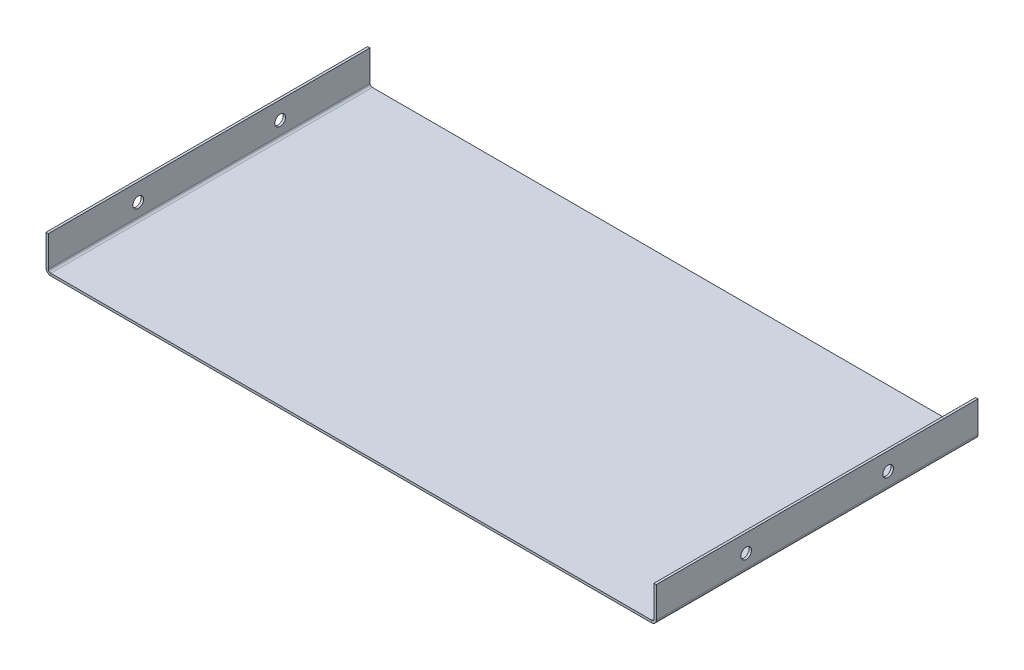
ISO-10303-21;
HEADER;
FILE_DESCRIPTION(('STEP AP214'),'2;1');
FILE_NAME('part.step','',(''),(''),'','','');
FILE_SCHEMA(('AUTOMOTIVE_DESIGN { 1 0 10303 214 1 1 1 1 }'));
ENDSEC;
DATA;
#1=APPLICATION_CONTEXT('core data for automotive mechanical design processes');
#2=APPLICATION_PROTOCOL_DEFINITION('international standard','automotive_design',2000,#1);
#3=PRODUCT_CONTEXT('',#1,'mechanical');
#4=PRODUCT('Part','Part','',(#3));
#5=PRODUCT_RELATED_PRODUCT_CATEGORY('part','',(#4));
#6=PRODUCT_DEFINITION_FORMATION('','',#4);
#7=PRODUCT_DEFINITION_CONTEXT('part definition',#1,'design');
#8=PRODUCT_DEFINITION('design','',#6,#7);
#9=PRODUCT_DEFINITION_SHAPE('','',#8);
#10=(LENGTH_UNIT() NAMED_UNIT(*) SI_UNIT(.MILLI.,.METRE.));
#11=(NAMED_UNIT(*) PLANE_ANGLE_UNIT() SI_UNIT($,.RADIAN.));
#12=(NAMED_UNIT(*) SI_UNIT($,.STERADIAN.) SOLID_ANGLE_UNIT());
#13=UNCERTAINTY_MEASURE_WITH_UNIT(LENGTH_MEASURE(1.E-05),#10,'distance_accuracy_value','');
#14=(GEOMETRIC_REPRESENTATION_CONTEXT(3) GLOBAL_UNCERTAINTY_ASSIGNED_CONTEXT((#13)) GLOBAL_UNIT_ASSIGNED_CONTEXT((#10,
#11,#12)) REPRESENTATION_CONTEXT('',''));
#15=CARTESIAN_POINT('',(0.,0.,0.));
#16=DIRECTION('',(0.,0.,1.));
#17=DIRECTION('',(1.,0.,0.));
#18=AXIS2_PLACEMENT_3D('',#15,#16,#17);
#19=CARTESIAN_POINT('',(0.,-1.,0.));
#20=DIRECTION('',(0.,-1.,0.));
#21=DIRECTION('',(0.,0.,-1.));
#22=AXIS2_PLACEMENT_3D('',#19,#20,#21);
#23=PLANE('',#22);
#24=DIRECTION('',(-1.,0.,0.));
#25=VECTOR('',#24,1.);
#26=CARTESIAN_POINT('',(0.,-1.,-136.));
#27=LINE('',#26,#25);
#28=CARTESIAN_POINT('',(255.,-0.999999999999996,-136.));
#29=VERTEX_POINT('',#28);
#30=CARTESIAN_POINT('',(0.999999999999997,-1.,-136.));
#31=VERTEX_POINT('',#30);
#32=EDGE_CURVE('E11',#29,#31,#27,.T.);
#33=ORIENTED_EDGE('',*,*,#32,.F.);
#34=DIRECTION('',(0.,0.,-1.));
#35=VECTOR('',#34,1.);
#36=CARTESIAN_POINT('',(255.,-0.999999999999996,-136.));
#37=LINE('',#36,#35);
#38=CARTESIAN_POINT('',(255.,-1.,0.));
#39=VERTEX_POINT('',#38);
#40=EDGE_CURVE('E217',#29,#39,#37,.F.);
#41=ORIENTED_EDGE('',*,*,#40,.T.);
#42=DIRECTION('',(1.,0.,0.));
#43=VECTOR('',#42,1.);
#44=CARTESIAN_POINT('',(0.,-1.,0.));
#45=LINE('',#44,#43);
#46=CARTESIAN_POINT('',(0.999999999999997,-1.,0.));
#47=VERTEX_POINT('',#46);
#48=EDGE_CURVE('E48',#47,#39,#45,.T.);
#49=ORIENTED_EDGE('',*,*,#48,.F.);
#50=DIRECTION('',(0.,0.,1.));
#51=VECTOR('',#50,1.);
#52=CARTESIAN_POINT('',(0.999999999999997,-1.,0.));
#53=LINE('',#52,#51);
#54=EDGE_CURVE('E62',#47,#31,#53,.F.);
#55=ORIENTED_EDGE('',*,*,#54,.T.);
#56=EDGE_LOOP('',(#33,#41,#49,#55));
#57=FACE_BOUND('',#56,.T.);
#58=ADVANCED_FACE('F39',(#57),#23,.T.);
#59=CARTESIAN_POINT('',(0.,0.,0.));
#60=DIRECTION('',(0.,-1.,0.));
#61=DIRECTION('',(0.,0.,-1.));
#62=AXIS2_PLACEMENT_3D('',#59,#60,#61);
#63=PLANE('',#62);
#64=DIRECTION('',(0.,0.,-1.));
#65=VECTOR('',#64,1.);
#66=CARTESIAN_POINT('',(255.,0.,-136.));
#67=LINE('',#66,#65);
#68=CARTESIAN_POINT('',(255.,0.,-136.));
#69=VERTEX_POINT('',#68);
#70=CARTESIAN_POINT('',(255.,0.,0.));
#71=VERTEX_POINT('',#70);
#72=EDGE_CURVE('E230',#69,#71,#67,.F.);
#73=ORIENTED_EDGE('',*,*,#72,.F.);
#74=DIRECTION('',(-1.,0.,0.));
#75=VECTOR('',#74,1.);
#76=CARTESIAN_POINT('',(0.,0.,-136.));
#77=LINE('',#76,#75);
#78=CARTESIAN_POINT('',(0.999999999999997,0.,-136.));
#79=VERTEX_POINT('',#78);
#80=EDGE_CURVE('E151',#69,#79,#77,.T.);
#81=ORIENTED_EDGE('',*,*,#80,.T.);
#82=DIRECTION('',(0.,0.,1.));
#83=VECTOR('',#82,1.);
#84=CARTESIAN_POINT('',(0.999999999999997,0.,0.));
#85=LINE('',#84,#83);
#86=CARTESIAN_POINT('',(0.999999999999997,0.,0.));
#87=VERTEX_POINT('',#86);
#88=EDGE_CURVE('E106',#87,#79,#85,.F.);
#89=ORIENTED_EDGE('',*,*,#88,.F.);
#90=DIRECTION('',(1.,0.,0.));
#91=VECTOR('',#90,1.);
#92=CARTESIAN_POINT('',(0.,0.,0.));
#93=LINE('',#92,#91);
#94=EDGE_CURVE('E148',#87,#71,#93,.T.);
#95=ORIENTED_EDGE('',*,*,#94,.T.);
#96=EDGE_LOOP('',(#73,#81,#89,#95));
#97=FACE_BOUND('',#96,.T.);
#98=ADVANCED_FACE('F339',(#97),#63,.F.);
#99=CARTESIAN_POINT('',(0.,-1.,-136.));
#100=DIRECTION('',(0.,0.,-1.));
#101=DIRECTION('',(-1.,0.,0.));
#102=AXIS2_PLACEMENT_3D('',#99,#100,#101);
#103=PLANE('',#102);
#104=ORIENTED_EDGE('',*,*,#80,.F.);
#105=DIRECTION('',(0.,-1.,0.));
#106=VECTOR('',#105,1.);
#107=CARTESIAN_POINT('',(255.,0.,-136.));
#108=LINE('',#107,#106);
#109=EDGE_CURVE('E224',#69,#29,#108,.T.);
#110=ORIENTED_EDGE('',*,*,#109,.T.);
#111=ORIENTED_EDGE('',*,*,#32,.T.);
#112=DIRECTION('',(0.,-1.,0.));
#113=VECTOR('',#112,1.);
#114=CARTESIAN_POINT('',(0.999999999999997,0.,-136.));
#115=LINE('',#114,#113);
#116=EDGE_CURVE('E145',#79,#31,#115,.T.);
#117=ORIENTED_EDGE('',*,*,#116,.F.);
#118=EDGE_LOOP('',(#104,#110,#111,#117));
#119=FACE_BOUND('',#118,.T.);
#120=ADVANCED_FACE('F345',(#119),#103,.T.);
#121=CARTESIAN_POINT('',(0.,-1.,0.));
#122=DIRECTION('',(0.,0.,1.));
#123=DIRECTION('',(1.,0.,0.));
#124=AXIS2_PLACEMENT_3D('',#121,#122,#123);
#125=PLANE('',#124);
#126=DIRECTION('',(0.,-1.,0.));
#127=VECTOR('',#126,1.);
#128=CARTESIAN_POINT('',(255.,0.,0.));
#129=LINE('',#128,#127);
#130=EDGE_CURVE('E235',#71,#39,#129,.T.);
#131=ORIENTED_EDGE('',*,*,#130,.F.);
#132=ORIENTED_EDGE('',*,*,#94,.F.);
#133=DIRECTION('',(0.,-1.,0.));
#134=VECTOR('',#133,1.);
#135=CARTESIAN_POINT('',(0.999999999999997,0.,0.));
#136=LINE('',#135,#134);
#137=EDGE_CURVE('E105',#87,#47,#136,.T.);
#138=ORIENTED_EDGE('',*,*,#137,.T.);
#139=ORIENTED_EDGE('',*,*,#48,.T.);
#140=EDGE_LOOP('',(#131,#132,#138,#139));
#141=FACE_BOUND('',#140,.T.);
#142=ADVANCED_FACE('F41',(#141),#125,.T.);
#143=CARTESIAN_POINT('',(0.999999999999997,1.,-136.));
#144=DIRECTION('',(0.,0.,-1.));
#145=DIRECTION('',(-1.,0.,0.));
#146=AXIS2_PLACEMENT_3D('',#143,#144,#145);
#147=PLANE('',#146);
#148=DIRECTION('',(-1.,0.,0.));
#149=VECTOR('',#148,1.);
#150=CARTESIAN_POINT('',(0.,0.999999999999997,-136.));
#151=LINE('',#150,#149);
#152=CARTESIAN_POINT('',(0.,0.999999999999997,-136.));
#153=VERTEX_POINT('',#152);
#154=CARTESIAN_POINT('',(-1.,0.999999999999993,-136.));
#155=VERTEX_POINT('',#154);
#156=EDGE_CURVE('E96',#153,#155,#151,.T.);
#157=ORIENTED_EDGE('',*,*,#156,.F.);
#158=CARTESIAN_POINT('',(0.999999999999997,1.,-136.));
#159=DIRECTION('',(0.,0.,1.));
#160=DIRECTION('',(1.,0.,0.));
#161=AXIS2_PLACEMENT_3D('',#158,#159,#160);
#162=CIRCLE('',#161,1.);
#163=EDGE_CURVE('E90',#79,#153,#162,.F.);
#164=ORIENTED_EDGE('',*,*,#163,.F.);
#165=ORIENTED_EDGE('',*,*,#116,.T.);
#166=CARTESIAN_POINT('',(0.999999999999997,1.,-136.));
#167=DIRECTION('',(0.,0.,1.));
#168=DIRECTION('',(1.,0.,0.));
#169=AXIS2_PLACEMENT_3D('',#166,#167,#168);
#170=CIRCLE('',#169,2.);
#171=EDGE_CURVE('E138',#31,#155,#170,.F.);
#172=ORIENTED_EDGE('',*,*,#171,.T.);
#173=EDGE_LOOP('',(#157,#164,#165,#172));
#174=FACE_BOUND('',#173,.T.);
#175=ADVANCED_FACE('F258',(#174),#147,.T.);
#176=CARTESIAN_POINT('',(0.999999999999997,1.,0.));
#177=DIRECTION('',(0.,0.,-1.));
#178=DIRECTION('',(-1.,0.,0.));
#179=AXIS2_PLACEMENT_3D('',#176,#177,#178);
#180=PLANE('',#179);
#181=CARTESIAN_POINT('',(0.999999999999997,1.,0.));
#182=DIRECTION('',(0.,0.,1.));
#183=DIRECTION('',(1.,0.,0.));
#184=AXIS2_PLACEMENT_3D('',#181,#182,#183);
#185=CIRCLE('',#184,1.);
#186=CARTESIAN_POINT('',(0.,0.999999999999997,0.));
#187=VERTEX_POINT('',#186);
#188=EDGE_CURVE('E87',#187,#87,#185,.T.);
#189=ORIENTED_EDGE('',*,*,#188,.F.);
#190=DIRECTION('',(-1.,0.,0.));
#191=VECTOR('',#190,1.);
#192=CARTESIAN_POINT('',(0.,0.999999999999997,0.));
#193=LINE('',#192,#191);
#194=CARTESIAN_POINT('',(-1.,0.999999999999993,0.));
#195=VERTEX_POINT('',#194);
#196=EDGE_CURVE('E95',#187,#195,#193,.T.);
#197=ORIENTED_EDGE('',*,*,#196,.T.);
#198=CARTESIAN_POINT('',(0.999999999999997,1.,0.));
#199=DIRECTION('',(0.,0.,1.));
#200=DIRECTION('',(1.,0.,0.));
#201=AXIS2_PLACEMENT_3D('',#198,#199,#200);
#202=CIRCLE('',#201,2.);
#203=EDGE_CURVE('E139',#195,#47,#202,.T.);
#204=ORIENTED_EDGE('',*,*,#203,.T.);
#205=ORIENTED_EDGE('',*,*,#137,.F.);
#206=EDGE_LOOP('',(#189,#197,#204,#205));
#207=FACE_BOUND('',#206,.T.);
#208=ADVANCED_FACE('F101',(#207),#180,.F.);
#209=CARTESIAN_POINT('',(0.999999999999997,1.,0.));
#210=DIRECTION('',(0.,0.,1.));
#211=DIRECTION('',(-1.,0.,0.));
#212=AXIS2_PLACEMENT_3D('',#209,#210,#211);
#213=CYLINDRICAL_SURFACE('',#212,2.);
#214=ORIENTED_EDGE('',*,*,#54,.F.);
#215=ORIENTED_EDGE('',*,*,#203,.F.);
#216=DIRECTION('',(0.,0.,-1.));
#217=VECTOR('',#216,1.);
#218=CARTESIAN_POINT('',(-1.,0.999999999999993,0.));
#219=LINE('',#218,#217);
#220=EDGE_CURVE('E119',#195,#155,#219,.T.);
#221=ORIENTED_EDGE('',*,*,#220,.T.);
#222=ORIENTED_EDGE('',*,*,#171,.F.);
#223=EDGE_LOOP('',(#214,#215,#221,#222));
#224=FACE_BOUND('',#223,.T.);
#225=ADVANCED_FACE('F259',(#224),#213,.T.);
#226=CARTESIAN_POINT('',(0.999999999999997,1.,0.));
#227=DIRECTION('',(0.,0.,1.));
#228=DIRECTION('',(-1.,0.,0.));
#229=AXIS2_PLACEMENT_3D('',#226,#227,#228);
#230=CYLINDRICAL_SURFACE('',#229,1.);
#231=ORIENTED_EDGE('',*,*,#88,.T.);
#232=ORIENTED_EDGE('',*,*,#163,.T.);
#233=DIRECTION('',(0.,0.,1.));
#234=VECTOR('',#233,1.);
#235=CARTESIAN_POINT('',(0.,0.999999999999997,-136.));
#236=LINE('',#235,#234);
#237=EDGE_CURVE('E83',#153,#187,#236,.T.);
#238=ORIENTED_EDGE('',*,*,#237,.T.);
#239=ORIENTED_EDGE('',*,*,#188,.T.);
#240=EDGE_LOOP('',(#231,#232,#238,#239));
#241=FACE_BOUND('',#240,.T.);
#242=ADVANCED_FACE('F86',(#241),#230,.F.);
#243=CARTESIAN_POINT('',(-1.,0.,-136.));
#244=DIRECTION('',(0.,0.,1.));
#245=DIRECTION('',(1.,0.,0.));
#246=AXIS2_PLACEMENT_3D('',#243,#244,#245);
#247=PLANE('',#246);
#248=ORIENTED_EDGE('',*,*,#156,.T.);
#249=DIRECTION('',(0.,-1.,0.));
#250=VECTOR('',#249,1.);
#251=CARTESIAN_POINT('',(-1.,0.,-136.));
#252=LINE('',#251,#250);
#253=CARTESIAN_POINT('',(-1.00000000000005,14.,-136.));
#254=VERTEX_POINT('',#253);
#255=EDGE_CURVE('E127',#254,#155,#252,.T.);
#256=ORIENTED_EDGE('',*,*,#255,.F.);
#257=DIRECTION('',(1.,0.,0.));
#258=VECTOR('',#257,1.);
#259=CARTESIAN_POINT('',(-1.00000000000005,14.,-136.));
#260=LINE('',#259,#258);
#261=CARTESIAN_POINT('',(0.,14.,-136.));
#262=VERTEX_POINT('',#261);
#263=EDGE_CURVE('E132',#254,#262,#260,.T.);
#264=ORIENTED_EDGE('',*,*,#263,.T.);
#265=DIRECTION('',(0.,-1.,0.));
#266=VECTOR('',#265,1.);
#267=CARTESIAN_POINT('',(0.,0.,-136.));
#268=LINE('',#267,#266);
#269=EDGE_CURVE('E125',#262,#153,#268,.T.);
#270=ORIENTED_EDGE('',*,*,#269,.T.);
#271=EDGE_LOOP('',(#248,#256,#264,#270));
#272=FACE_BOUND('',#271,.T.);
#273=ADVANCED_FACE('F256',(#272),#247,.F.);
#274=CARTESIAN_POINT('',(-1.00000000000005,14.,0.));
#275=DIRECTION('',(0.,0.,-1.));
#276=DIRECTION('',(-1.,0.,0.));
#277=AXIS2_PLACEMENT_3D('',#274,#275,#276);
#278=PLANE('',#277);
#279=ORIENTED_EDGE('',*,*,#196,.F.);
#280=DIRECTION('',(0.,1.,0.));
#281=VECTOR('',#280,1.);
#282=CARTESIAN_POINT('',(0.,14.,0.));
#283=LINE('',#282,#281);
#284=CARTESIAN_POINT('',(0.,14.,0.));
#285=VERTEX_POINT('',#284);
#286=EDGE_CURVE('E115',#187,#285,#283,.T.);
#287=ORIENTED_EDGE('',*,*,#286,.T.);
#288=DIRECTION('',(1.,0.,0.));
#289=VECTOR('',#288,1.);
#290=CARTESIAN_POINT('',(-1.00000000000005,14.,0.));
#291=LINE('',#290,#289);
#292=CARTESIAN_POINT('',(-1.00000000000005,14.,0.));
#293=VERTEX_POINT('',#292);
#294=EDGE_CURVE('E107',#293,#285,#291,.T.);
#295=ORIENTED_EDGE('',*,*,#294,.F.);
#296=DIRECTION('',(0.,1.,0.));
#297=VECTOR('',#296,1.);
#298=CARTESIAN_POINT('',(-1.00000000000005,14.,0.));
#299=LINE('',#298,#297);
#300=EDGE_CURVE('E118',#195,#293,#299,.T.);
#301=ORIENTED_EDGE('',*,*,#300,.F.);
#302=EDGE_LOOP('',(#279,#287,#295,#301));
#303=FACE_BOUND('',#302,.T.);
#304=ADVANCED_FACE('F112',(#303),#278,.F.);
#305=CARTESIAN_POINT('',(-1.,0.,0.));
#306=DIRECTION('',(1.,0.,0.));
#307=DIRECTION('',(0.,1.,0.));
#308=AXIS2_PLACEMENT_3D('',#305,#306,#307);
#309=PLANE('',#308);
#310=CARTESIAN_POINT('',(-1.,6.50000000000056,-98.0000000000018));
#311=DIRECTION('',(1.,0.,0.));
#312=DIRECTION('',(0.,1.,0.));
#313=AXIS2_PLACEMENT_3D('',#310,#311,#312);
#314=CIRCLE('',#313,2.24999999999995);
#315=CARTESIAN_POINT('',(-1.00000000000001,8.75000000000052,-98.0000000000018));
#316=VERTEX_POINT('',#315);
#317=EDGE_CURVE('E177',#316,#316,#314,.T.);
#318=ORIENTED_EDGE('',*,*,#317,.T.);
#319=EDGE_LOOP('',(#318));
#320=FACE_BOUND('',#319,.T.);
#321=CARTESIAN_POINT('',(-1.,6.50000000000056,-38.0000000000018));
#322=DIRECTION('',(1.,0.,0.));
#323=DIRECTION('',(0.,1.,0.));
#324=AXIS2_PLACEMENT_3D('',#321,#322,#323);
#325=CIRCLE('',#324,2.24999999999996);
#326=CARTESIAN_POINT('',(-1.00000000000001,8.75000000000052,-38.0000000000018));
#327=VERTEX_POINT('',#326);
#328=EDGE_CURVE('E166',#327,#327,#325,.T.);
#329=ORIENTED_EDGE('',*,*,#328,.T.);
#330=EDGE_LOOP('',(#329));
#331=FACE_BOUND('',#330,.T.);
#332=ORIENTED_EDGE('',*,*,#220,.F.);
#333=ORIENTED_EDGE('',*,*,#300,.T.);
#334=DIRECTION('',(0.,0.,-1.));
#335=VECTOR('',#334,1.);
#336=CARTESIAN_POINT('',(-1.00000000000005,14.,-136.));
#337=LINE('',#336,#335);
#338=EDGE_CURVE('E135',#293,#254,#337,.T.);
#339=ORIENTED_EDGE('',*,*,#338,.T.);
#340=ORIENTED_EDGE('',*,*,#255,.T.);
#341=EDGE_LOOP('',(#332,#333,#339,#340));
#342=FACE_BOUND('',#341,.T.);
#343=ADVANCED_FACE('F248',(#320,#331,#342),#309,.F.);
#344=CARTESIAN_POINT('',(0.,0.,0.));
#345=DIRECTION('',(1.,0.,0.));
#346=DIRECTION('',(0.,1.,0.));
#347=AXIS2_PLACEMENT_3D('',#344,#345,#346);
#348=PLANE('',#347);
#349=CARTESIAN_POINT('',(0.,6.50000000000056,-98.0000000000018));
#350=DIRECTION('',(1.,0.,0.));
#351=DIRECTION('',(0.,1.,0.));
#352=AXIS2_PLACEMENT_3D('',#349,#350,#351);
#353=CIRCLE('',#352,2.24999999999995);
#354=CARTESIAN_POINT('',(0.,8.75000000000052,-98.0000000000018));
#355=VERTEX_POINT('',#354);
#356=EDGE_CURVE('E174',#355,#355,#353,.T.);
#357=ORIENTED_EDGE('',*,*,#356,.F.);
#358=EDGE_LOOP('',(#357));
#359=FACE_BOUND('',#358,.T.);
#360=CARTESIAN_POINT('',(0.,6.50000000000056,-38.0000000000018));
#361=DIRECTION('',(1.,0.,0.));
#362=DIRECTION('',(0.,1.,0.));
#363=AXIS2_PLACEMENT_3D('',#360,#361,#362);
#364=CIRCLE('',#363,2.24999999999996);
#365=CARTESIAN_POINT('',(0.,8.75000000000052,-38.0000000000018));
#366=VERTEX_POINT('',#365);
#367=EDGE_CURVE('E161',#366,#366,#364,.T.);
#368=ORIENTED_EDGE('',*,*,#367,.F.);
#369=EDGE_LOOP('',(#368));
#370=FACE_BOUND('',#369,.T.);
#371=ORIENTED_EDGE('',*,*,#286,.F.);
#372=ORIENTED_EDGE('',*,*,#237,.F.);
#373=ORIENTED_EDGE('',*,*,#269,.F.);
#374=DIRECTION('',(0.,0.,-1.));
#375=VECTOR('',#374,1.);
#376=CARTESIAN_POINT('',(0.,14.,-136.));
#377=LINE('',#376,#375);
#378=EDGE_CURVE('E124',#285,#262,#377,.T.);
#379=ORIENTED_EDGE('',*,*,#378,.F.);
#380=EDGE_LOOP('',(#371,#372,#373,#379));
#381=FACE_BOUND('',#380,.T.);
#382=ADVANCED_FACE('F122',(#359,#370,#381),#348,.T.);
#383=CARTESIAN_POINT('',(-1.00000000000005,14.,-136.));
#384=DIRECTION('',(0.,-1.,0.));
#385=DIRECTION('',(1.,0.,0.));
#386=AXIS2_PLACEMENT_3D('',#383,#384,#385);
#387=PLANE('',#386);
#388=ORIENTED_EDGE('',*,*,#378,.T.);
#389=ORIENTED_EDGE('',*,*,#263,.F.);
#390=ORIENTED_EDGE('',*,*,#338,.F.);
#391=ORIENTED_EDGE('',*,*,#294,.T.);
#392=EDGE_LOOP('',(#388,#389,#390,#391));
#393=FACE_BOUND('',#392,.T.);
#394=ADVANCED_FACE('F253',(#393),#387,.F.);
#395=CARTESIAN_POINT('',(255.,1.,0.));
#396=DIRECTION('',(0.,0.,1.));
#397=DIRECTION('',(1.,0.,0.));
#398=AXIS2_PLACEMENT_3D('',#395,#396,#397);
#399=PLANE('',#398);
#400=DIRECTION('',(1.,0.,0.));
#401=VECTOR('',#400,1.);
#402=CARTESIAN_POINT('',(256.,1.,0.));
#403=LINE('',#402,#401);
#404=CARTESIAN_POINT('',(256.,1.,0.));
#405=VERTEX_POINT('',#404);
#406=CARTESIAN_POINT('',(257.,0.999999999999997,0.));
#407=VERTEX_POINT('',#406);
#408=EDGE_CURVE('E180',#405,#407,#403,.T.);
#409=ORIENTED_EDGE('',*,*,#408,.F.);
#410=CARTESIAN_POINT('',(255.,1.,0.));
#411=DIRECTION('',(0.,0.,-1.));
#412=DIRECTION('',(-1.,0.,0.));
#413=AXIS2_PLACEMENT_3D('',#410,#411,#412);
#414=CIRCLE('',#413,1.);
#415=EDGE_CURVE('E227',#71,#405,#414,.F.);
#416=ORIENTED_EDGE('',*,*,#415,.F.);
#417=ORIENTED_EDGE('',*,*,#130,.T.);
#418=CARTESIAN_POINT('',(255.,1.,0.));
#419=DIRECTION('',(0.,0.,-1.));
#420=DIRECTION('',(-1.,0.,0.));
#421=AXIS2_PLACEMENT_3D('',#418,#419,#420);
#422=CIRCLE('',#421,2.);
#423=EDGE_CURVE('E220',#39,#407,#422,.F.);
#424=ORIENTED_EDGE('',*,*,#423,.T.);
#425=EDGE_LOOP('',(#409,#416,#417,#424));
#426=FACE_BOUND('',#425,.T.);
#427=ADVANCED_FACE('F317',(#426),#399,.T.);
#428=CARTESIAN_POINT('',(255.,1.,-136.));
#429=DIRECTION('',(0.,0.,1.));
#430=DIRECTION('',(1.,0.,0.));
#431=AXIS2_PLACEMENT_3D('',#428,#429,#430);
#432=PLANE('',#431);
#433=CARTESIAN_POINT('',(255.,1.,-136.));
#434=DIRECTION('',(0.,0.,-1.));
#435=DIRECTION('',(-1.,0.,0.));
#436=AXIS2_PLACEMENT_3D('',#433,#434,#435);
#437=CIRCLE('',#436,1.);
#438=CARTESIAN_POINT('',(256.,1.,-136.));
#439=VERTEX_POINT('',#438);
#440=EDGE_CURVE('E216',#439,#69,#437,.T.);
#441=ORIENTED_EDGE('',*,*,#440,.F.);
#442=DIRECTION('',(1.,0.,0.));
#443=VECTOR('',#442,1.);
#444=CARTESIAN_POINT('',(256.,1.,-136.));
#445=LINE('',#444,#443);
#446=CARTESIAN_POINT('',(257.,0.999999999999997,-136.));
#447=VERTEX_POINT('',#446);
#448=EDGE_CURVE('E184',#439,#447,#445,.T.);
#449=ORIENTED_EDGE('',*,*,#448,.T.);
#450=CARTESIAN_POINT('',(255.,1.,-136.));
#451=DIRECTION('',(0.,0.,-1.));
#452=DIRECTION('',(-1.,0.,0.));
#453=AXIS2_PLACEMENT_3D('',#450,#451,#452);
#454=CIRCLE('',#453,2.);
#455=EDGE_CURVE('E221',#447,#29,#454,.T.);
#456=ORIENTED_EDGE('',*,*,#455,.T.);
#457=ORIENTED_EDGE('',*,*,#109,.F.);
#458=EDGE_LOOP('',(#441,#449,#456,#457));
#459=FACE_BOUND('',#458,.T.);
#460=ADVANCED_FACE('F298',(#459),#432,.F.);
#461=CARTESIAN_POINT('',(255.,1.,-136.));
#462=DIRECTION('',(0.,0.,-1.));
#463=DIRECTION('',(1.,0.,0.));
#464=AXIS2_PLACEMENT_3D('',#461,#462,#463);
#465=CYLINDRICAL_SURFACE('',#464,2.);
#466=ORIENTED_EDGE('',*,*,#40,.F.);
#467=ORIENTED_EDGE('',*,*,#455,.F.);
#468=DIRECTION('',(0.,0.,1.));
#469=VECTOR('',#468,1.);
#470=CARTESIAN_POINT('',(257.,0.999999999999997,0.));
#471=LINE('',#470,#469);
#472=EDGE_CURVE('E187',#447,#407,#471,.T.);
#473=ORIENTED_EDGE('',*,*,#472,.T.);
#474=ORIENTED_EDGE('',*,*,#423,.F.);
#475=EDGE_LOOP('',(#466,#467,#473,#474));
#476=FACE_BOUND('',#475,.T.);
#477=ADVANCED_FACE('F293',(#476),#465,.T.);
#478=CARTESIAN_POINT('',(255.,1.,-136.));
#479=DIRECTION('',(0.,0.,-1.));
#480=DIRECTION('',(1.,0.,0.));
#481=AXIS2_PLACEMENT_3D('',#478,#479,#480);
#482=CYLINDRICAL_SURFACE('',#481,1.);
#483=ORIENTED_EDGE('',*,*,#72,.T.);
#484=ORIENTED_EDGE('',*,*,#415,.T.);
#485=DIRECTION('',(0.,0.,-1.));
#486=VECTOR('',#485,1.);
#487=CARTESIAN_POINT('',(256.,1.,0.));
#488=LINE('',#487,#486);
#489=EDGE_CURVE('E181',#405,#439,#488,.T.);
#490=ORIENTED_EDGE('',*,*,#489,.T.);
#491=ORIENTED_EDGE('',*,*,#440,.T.);
#492=EDGE_LOOP('',(#483,#484,#490,#491));
#493=FACE_BOUND('',#492,.T.);
#494=ADVANCED_FACE('F321',(#493),#482,.F.);
#495=CARTESIAN_POINT('',(257.,0.,0.));
#496=DIRECTION('',(0.,0.,-1.));
#497=DIRECTION('',(-1.,0.,0.));
#498=AXIS2_PLACEMENT_3D('',#495,#496,#497);
#499=PLANE('',#498);
#500=ORIENTED_EDGE('',*,*,#408,.T.);
#501=DIRECTION('',(0.,-1.,0.));
#502=VECTOR('',#501,1.);
#503=CARTESIAN_POINT('',(257.,0.,0.));
#504=LINE('',#503,#502);
#505=CARTESIAN_POINT('',(257.,14.,0.));
#506=VERTEX_POINT('',#505);
#507=EDGE_CURVE('E193',#506,#407,#504,.T.);
#508=ORIENTED_EDGE('',*,*,#507,.F.);
#509=DIRECTION('',(-1.,0.,0.));
#510=VECTOR('',#509,1.);
#511=CARTESIAN_POINT('',(257.,14.,0.));
#512=LINE('',#511,#510);
#513=CARTESIAN_POINT('',(256.,14.,0.));
#514=VERTEX_POINT('',#513);
#515=EDGE_CURVE('E203',#506,#514,#512,.T.);
#516=ORIENTED_EDGE('',*,*,#515,.T.);
#517=DIRECTION('',(0.,-1.,0.));
#518=VECTOR('',#517,1.);
#519=CARTESIAN_POINT('',(256.,0.,0.));
#520=LINE('',#519,#518);
#521=EDGE_CURVE('E192',#514,#405,#520,.T.);
#522=ORIENTED_EDGE('',*,*,#521,.T.);
#523=EDGE_LOOP('',(#500,#508,#516,#522));
#524=FACE_BOUND('',#523,.T.);
#525=ADVANCED_FACE('F314',(#524),#499,.F.);
#526=CARTESIAN_POINT('',(257.,14.,-136.));
#527=DIRECTION('',(0.,0.,1.));
#528=DIRECTION('',(1.,0.,0.));
#529=AXIS2_PLACEMENT_3D('',#526,#527,#528);
#530=PLANE('',#529);
#531=ORIENTED_EDGE('',*,*,#448,.F.);
#532=DIRECTION('',(0.,1.,0.));
#533=VECTOR('',#532,1.);
#534=CARTESIAN_POINT('',(256.,14.,-136.));
#535=LINE('',#534,#533);
#536=CARTESIAN_POINT('',(256.,14.,-136.));
#537=VERTEX_POINT('',#536);
#538=EDGE_CURVE('E206',#439,#537,#535,.T.);
#539=ORIENTED_EDGE('',*,*,#538,.T.);
#540=DIRECTION('',(-1.,0.,0.));
#541=VECTOR('',#540,1.);
#542=CARTESIAN_POINT('',(257.,14.,-136.));
#543=LINE('',#542,#541);
#544=CARTESIAN_POINT('',(257.,14.,-136.));
#545=VERTEX_POINT('',#544);
#546=EDGE_CURVE('E213',#545,#537,#543,.T.);
#547=ORIENTED_EDGE('',*,*,#546,.F.);
#548=DIRECTION('',(0.,1.,0.));
#549=VECTOR('',#548,1.);
#550=CARTESIAN_POINT('',(257.,14.,-136.));
#551=LINE('',#550,#549);
#552=EDGE_CURVE('E196',#447,#545,#551,.T.);
#553=ORIENTED_EDGE('',*,*,#552,.F.);
#554=EDGE_LOOP('',(#531,#539,#547,#553));
#555=FACE_BOUND('',#554,.T.);
#556=ADVANCED_FACE('F306',(#555),#530,.F.);
#557=CARTESIAN_POINT('',(257.,-1.0185525324247E-12,0.));
#558=DIRECTION('',(-1.,0.,0.));
#559=DIRECTION('',(0.,-1.,0.));
#560=AXIS2_PLACEMENT_3D('',#557,#558,#559);
#561=PLANE('',#560);
#562=CARTESIAN_POINT('',(257.,6.50000000000105,-98.0000000000006));
#563=DIRECTION('',(-1.,0.,0.));
#564=DIRECTION('',(0.,-1.,0.));
#565=AXIS2_PLACEMENT_3D('',#562,#563,#564);
#566=CIRCLE('',#565,2.24999999999995);
#567=CARTESIAN_POINT('',(257.,4.2500000000011,-98.0000000000006));
#568=VERTEX_POINT('',#567);
#569=EDGE_CURVE('E171',#568,#568,#566,.T.);
#570=ORIENTED_EDGE('',*,*,#569,.T.);
#571=EDGE_LOOP('',(#570));
#572=FACE_BOUND('',#571,.T.);
#573=CARTESIAN_POINT('',(257.,6.50000000000105,-38.0000000000006));
#574=DIRECTION('',(-1.,0.,0.));
#575=DIRECTION('',(0.,-1.,0.));
#576=AXIS2_PLACEMENT_3D('',#573,#574,#575);
#577=CIRCLE('',#576,2.24999999999996);
#578=CARTESIAN_POINT('',(257.,4.25000000000109,-38.0000000000006));
#579=VERTEX_POINT('',#578);
#580=EDGE_CURVE('E157',#579,#579,#577,.T.);
#581=ORIENTED_EDGE('',*,*,#580,.T.);
#582=EDGE_LOOP('',(#581));
#583=FACE_BOUND('',#582,.T.);
#584=ORIENTED_EDGE('',*,*,#472,.F.);
#585=ORIENTED_EDGE('',*,*,#552,.T.);
#586=DIRECTION('',(0.,0.,1.));
#587=VECTOR('',#586,1.);
#588=CARTESIAN_POINT('',(257.,14.,0.));
#589=LINE('',#588,#587);
#590=EDGE_CURVE('E200',#545,#506,#589,.T.);
#591=ORIENTED_EDGE('',*,*,#590,.T.);
#592=ORIENTED_EDGE('',*,*,#507,.T.);
#593=EDGE_LOOP('',(#584,#585,#591,#592));
#594=FACE_BOUND('',#593,.T.);
#595=ADVANCED_FACE('F303',(#572,#583,#594),#561,.F.);
#596=CARTESIAN_POINT('',(256.,-1.01506105108586E-12,0.));
#597=DIRECTION('',(-1.,0.,0.));
#598=DIRECTION('',(0.,-1.,0.));
#599=AXIS2_PLACEMENT_3D('',#596,#597,#598);
#600=PLANE('',#599);
#601=CARTESIAN_POINT('',(256.,6.50000000000105,-98.0000000000006));
#602=DIRECTION('',(-1.,0.,0.));
#603=DIRECTION('',(0.,-1.,0.));
#604=AXIS2_PLACEMENT_3D('',#601,#602,#603);
#605=CIRCLE('',#604,2.24999999999995);
#606=CARTESIAN_POINT('',(256.,4.25000000000109,-98.0000000000006));
#607=VERTEX_POINT('',#606);
#608=EDGE_CURVE('E43',#607,#607,#605,.T.);
#609=ORIENTED_EDGE('',*,*,#608,.F.);
#610=EDGE_LOOP('',(#609));
#611=FACE_BOUND('',#610,.T.);
#612=CARTESIAN_POINT('',(256.,6.50000000000105,-38.0000000000006));
#613=DIRECTION('',(-1.,0.,0.));
#614=DIRECTION('',(0.,-1.,0.));
#615=AXIS2_PLACEMENT_3D('',#612,#613,#614);
#616=CIRCLE('',#615,2.24999999999996);
#617=CARTESIAN_POINT('',(256.,4.25000000000109,-38.0000000000006));
#618=VERTEX_POINT('',#617);
#619=EDGE_CURVE('E155',#618,#618,#616,.T.);
#620=ORIENTED_EDGE('',*,*,#619,.F.);
#621=EDGE_LOOP('',(#620));
#622=FACE_BOUND('',#621,.T.);
#623=ORIENTED_EDGE('',*,*,#538,.F.);
#624=ORIENTED_EDGE('',*,*,#489,.F.);
#625=ORIENTED_EDGE('',*,*,#521,.F.);
#626=DIRECTION('',(0.,0.,1.));
#627=VECTOR('',#626,1.);
#628=CARTESIAN_POINT('',(256.,14.,0.));
#629=LINE('',#628,#627);
#630=EDGE_CURVE('E197',#537,#514,#629,.T.);
#631=ORIENTED_EDGE('',*,*,#630,.F.);
#632=EDGE_LOOP('',(#623,#624,#625,#631));
#633=FACE_BOUND('',#632,.T.);
#634=ADVANCED_FACE('F324',(#611,#622,#633),#600,.T.);
#635=CARTESIAN_POINT('',(257.,14.,0.));
#636=DIRECTION('',(0.,-1.,0.));
#637=DIRECTION('',(1.,0.,0.));
#638=AXIS2_PLACEMENT_3D('',#635,#636,#637);
#639=PLANE('',#638);
#640=ORIENTED_EDGE('',*,*,#630,.T.);
#641=ORIENTED_EDGE('',*,*,#515,.F.);
#642=ORIENTED_EDGE('',*,*,#590,.F.);
#643=ORIENTED_EDGE('',*,*,#546,.T.);
#644=EDGE_LOOP('',(#640,#641,#642,#643));
#645=FACE_BOUND('',#644,.T.);
#646=ADVANCED_FACE('F311',(#645),#639,.F.);
#647=CARTESIAN_POINT('',(276.000000000002,6.50000000000108,-38.0000000000006));
#648=DIRECTION('',(-1.,0.,0.));
#649=DIRECTION('',(0.,0.,1.));
#650=AXIS2_PLACEMENT_3D('',#647,#648,#649);
#651=CYLINDRICAL_SURFACE('',#650,2.24999999999996);
#652=ORIENTED_EDGE('',*,*,#619,.T.);
#653=EDGE_LOOP('',(#652));
#654=FACE_BOUND('',#653,.T.);
#655=ORIENTED_EDGE('',*,*,#580,.F.);
#656=EDGE_LOOP('',(#655));
#657=FACE_BOUND('',#656,.T.);
#658=ADVANCED_FACE('F332',(#654,#657),#651,.F.);
#659=CARTESIAN_POINT('',(276.000000000002,6.50000000000108,-98.0000000000006));
#660=DIRECTION('',(-1.,0.,0.));
#661=DIRECTION('',(0.,0.,1.));
#662=AXIS2_PLACEMENT_3D('',#659,#660,#661);
#663=CYLINDRICAL_SURFACE('',#662,2.24999999999995);
#664=ORIENTED_EDGE('',*,*,#608,.T.);
#665=EDGE_LOOP('',(#664));
#666=FACE_BOUND('',#665,.T.);
#667=ORIENTED_EDGE('',*,*,#569,.F.);
#668=EDGE_LOOP('',(#667));
#669=FACE_BOUND('',#668,.T.);
#670=ADVANCED_FACE('F421',(#666,#669),#663,.F.);
#671=ORIENTED_EDGE('',*,*,#367,.T.);
#672=EDGE_LOOP('',(#671));
#673=FACE_BOUND('',#672,.T.);
#674=ORIENTED_EDGE('',*,*,#328,.F.);
#675=EDGE_LOOP('',(#674));
#676=FACE_BOUND('',#675,.T.);
#677=ADVANCED_FACE('F423',(#673,#676),#651,.F.);
#678=ORIENTED_EDGE('',*,*,#356,.T.);
#679=EDGE_LOOP('',(#678));
#680=FACE_BOUND('',#679,.T.);
#681=ORIENTED_EDGE('',*,*,#317,.F.);
#682=EDGE_LOOP('',(#681));
#683=FACE_BOUND('',#682,.T.);
#684=ADVANCED_FACE('F433',(#680,#683),#663,.F.);
#685=CLOSED_SHELL('',(#58,#98,#120,#142,#175,#208,#225,#242,#273,#304,#343,#382,#394,#427,#460,
#477,#494,#525,#556,#595,#634,#646,#658,#670,#677,#684));
#686=MANIFOLD_SOLID_BREP('B2',#685);
#687=ADVANCED_BREP_SHAPE_REPRESENTATION('',(#18,#686),#14);
#688=SHAPE_DEFINITION_REPRESENTATION(#9,#687);
ENDSEC;
END-ISO-10303-21;
